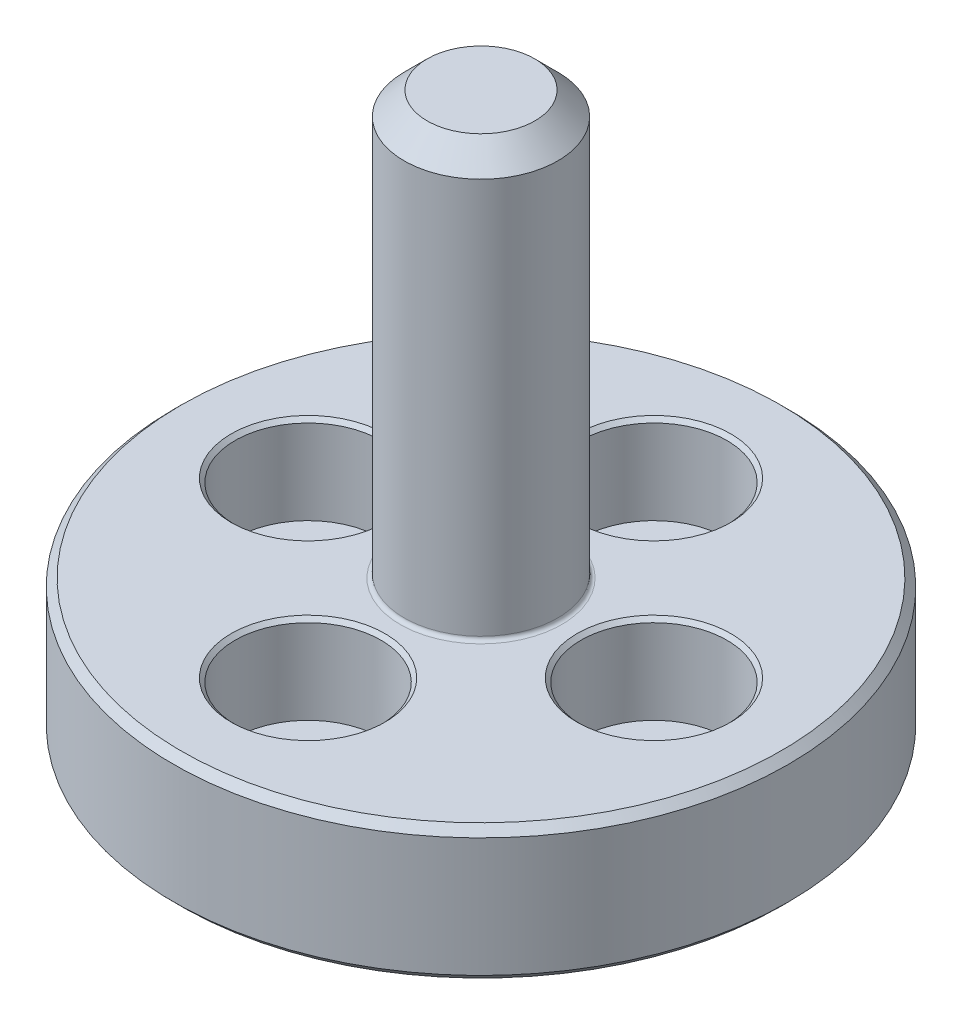
ISO-10303-21;
HEADER;
FILE_DESCRIPTION(('STEP AP214'),'2;1');
FILE_NAME('part.step','',(''),(''),'','','');
FILE_SCHEMA(('AUTOMOTIVE_DESIGN { 1 0 10303 214 1 1 1 1 }'));
ENDSEC;
DATA;
#1=APPLICATION_CONTEXT('core data for automotive mechanical design processes');
#2=APPLICATION_PROTOCOL_DEFINITION('international standard','automotive_design',2000,#1);
#3=PRODUCT_CONTEXT('',#1,'mechanical');
#4=PRODUCT('Part','Part','',(#3));
#5=PRODUCT_RELATED_PRODUCT_CATEGORY('part','',(#4));
#6=PRODUCT_DEFINITION_FORMATION('','',#4);
#7=PRODUCT_DEFINITION_CONTEXT('part definition',#1,'design');
#8=PRODUCT_DEFINITION('design','',#6,#7);
#9=PRODUCT_DEFINITION_SHAPE('','',#8);
#10=(LENGTH_UNIT() NAMED_UNIT(*) SI_UNIT(.MILLI.,.METRE.));
#11=(NAMED_UNIT(*) PLANE_ANGLE_UNIT() SI_UNIT($,.RADIAN.));
#12=(NAMED_UNIT(*) SI_UNIT($,.STERADIAN.) SOLID_ANGLE_UNIT());
#13=UNCERTAINTY_MEASURE_WITH_UNIT(LENGTH_MEASURE(1.E-05),#10,'distance_accuracy_value','');
#14=(GEOMETRIC_REPRESENTATION_CONTEXT(3) GLOBAL_UNCERTAINTY_ASSIGNED_CONTEXT((#13)) GLOBAL_UNIT_ASSIGNED_CONTEXT((#10,
#11,#12)) REPRESENTATION_CONTEXT('',''));
#15=CARTESIAN_POINT('',(0.,0.,0.));
#16=DIRECTION('',(0.,0.,1.));
#17=DIRECTION('',(1.,0.,0.));
#18=AXIS2_PLACEMENT_3D('',#15,#16,#17);
#19=CARTESIAN_POINT('',(-4.5,0.,0.));
#20=DIRECTION('',(0.,1.,0.));
#21=DIRECTION('',(-1.,0.,0.));
#22=AXIS2_PLACEMENT_3D('',#19,#20,#21);
#23=CYLINDRICAL_SURFACE('',#22,1.05);
#24=CARTESIAN_POINT('',(-4.5,0.099999999999995,0.));
#25=DIRECTION('',(0.,-1.,0.));
#26=DIRECTION('',(0.,0.,-1.));
#27=AXIS2_PLACEMENT_3D('',#24,#25,#26);
#28=CIRCLE('',#27,1.05);
#29=CARTESIAN_POINT('',(-4.5,0.099999999999995,-1.05000000000005));
#30=VERTEX_POINT('',#29);
#31=EDGE_CURVE('E92',#30,#30,#28,.T.);
#32=ORIENTED_EDGE('',*,*,#31,.T.);
#33=EDGE_LOOP('',(#32));
#34=FACE_BOUND('',#33,.T.);
#35=CARTESIAN_POINT('',(-4.5,1.2,0.));
#36=DIRECTION('',(0.,1.,0.));
#37=DIRECTION('',(-1.,0.,0.));
#38=AXIS2_PLACEMENT_3D('',#35,#36,#37);
#39=CIRCLE('',#38,1.05);
#40=CARTESIAN_POINT('',(-5.55,1.2,0.));
#41=VERTEX_POINT('',#40);
#42=EDGE_CURVE('E126',#41,#41,#39,.F.);
#43=ORIENTED_EDGE('',*,*,#42,.F.);
#44=EDGE_LOOP('',(#43));
#45=FACE_BOUND('',#44,.T.);
#46=ADVANCED_FACE('F36',(#34,#45),#23,.F.);
#47=CARTESIAN_POINT('',(0.,0.,4.5));
#48=DIRECTION('',(0.,1.,0.));
#49=DIRECTION('',(-1.,0.,0.));
#50=AXIS2_PLACEMENT_3D('',#47,#48,#49);
#51=CYLINDRICAL_SURFACE('',#50,1.05);
#52=CARTESIAN_POINT('',(0.,0.100000000000008,4.5));
#53=DIRECTION('',(0.,-1.,0.));
#54=DIRECTION('',(1.,0.,0.));
#55=AXIS2_PLACEMENT_3D('',#52,#53,#54);
#56=CIRCLE('',#55,1.05);
#57=CARTESIAN_POINT('',(1.05,0.100000000000008,4.5));
#58=VERTEX_POINT('',#57);
#59=EDGE_CURVE('E105',#58,#58,#56,.T.);
#60=ORIENTED_EDGE('',*,*,#59,.T.);
#61=EDGE_LOOP('',(#60));
#62=FACE_BOUND('',#61,.T.);
#63=CARTESIAN_POINT('',(0.,1.2,4.5));
#64=DIRECTION('',(0.,1.,0.));
#65=DIRECTION('',(-1.,0.,0.));
#66=AXIS2_PLACEMENT_3D('',#63,#64,#65);
#67=CIRCLE('',#66,1.05);
#68=CARTESIAN_POINT('',(-1.05,1.2,4.5));
#69=VERTEX_POINT('',#68);
#70=EDGE_CURVE('E132',#69,#69,#67,.F.);
#71=ORIENTED_EDGE('',*,*,#70,.F.);
#72=EDGE_LOOP('',(#71));
#73=FACE_BOUND('',#72,.T.);
#74=ADVANCED_FACE('F193',(#62,#73),#51,.F.);
#75=CARTESIAN_POINT('',(4.5,0.,0.));
#76=DIRECTION('',(0.,1.,0.));
#77=DIRECTION('',(-1.,0.,0.));
#78=AXIS2_PLACEMENT_3D('',#75,#76,#77);
#79=CYLINDRICAL_SURFACE('',#78,1.05);
#80=CARTESIAN_POINT('',(4.5,0.0999999999999953,0.));
#81=DIRECTION('',(0.,-1.,0.));
#82=DIRECTION('',(0.,0.,-1.));
#83=AXIS2_PLACEMENT_3D('',#80,#81,#82);
#84=CIRCLE('',#83,1.05);
#85=CARTESIAN_POINT('',(4.5,0.0999999999999953,-1.04999999999998));
#86=VERTEX_POINT('',#85);
#87=EDGE_CURVE('E119',#86,#86,#84,.T.);
#88=ORIENTED_EDGE('',*,*,#87,.T.);
#89=EDGE_LOOP('',(#88));
#90=FACE_BOUND('',#89,.T.);
#91=CARTESIAN_POINT('',(4.5,1.2,0.));
#92=DIRECTION('',(0.,1.,0.));
#93=DIRECTION('',(-1.,0.,0.));
#94=AXIS2_PLACEMENT_3D('',#91,#92,#93);
#95=CIRCLE('',#94,1.05);
#96=CARTESIAN_POINT('',(3.45,1.2,0.));
#97=VERTEX_POINT('',#96);
#98=EDGE_CURVE('E136',#97,#97,#95,.F.);
#99=ORIENTED_EDGE('',*,*,#98,.F.);
#100=EDGE_LOOP('',(#99));
#101=FACE_BOUND('',#100,.T.);
#102=ADVANCED_FACE('F199',(#90,#101),#79,.F.);
#103=CARTESIAN_POINT('',(0.,0.,-4.5));
#104=DIRECTION('',(0.,1.,0.));
#105=DIRECTION('',(-1.,0.,0.));
#106=AXIS2_PLACEMENT_3D('',#103,#104,#105);
#107=CYLINDRICAL_SURFACE('',#106,1.05);
#108=CARTESIAN_POINT('',(0.,0.100000000000001,-4.5));
#109=DIRECTION('',(0.,-1.,0.));
#110=DIRECTION('',(1.,0.,0.));
#111=AXIS2_PLACEMENT_3D('',#108,#109,#110);
#112=CIRCLE('',#111,1.05);
#113=CARTESIAN_POINT('',(1.05,0.1,-4.5));
#114=VERTEX_POINT('',#113);
#115=EDGE_CURVE('E147',#114,#114,#112,.T.);
#116=ORIENTED_EDGE('',*,*,#115,.T.);
#117=EDGE_LOOP('',(#116));
#118=FACE_BOUND('',#117,.T.);
#119=CARTESIAN_POINT('',(0.,1.2,-4.5));
#120=DIRECTION('',(0.,1.,0.));
#121=DIRECTION('',(-1.,0.,0.));
#122=AXIS2_PLACEMENT_3D('',#119,#120,#121);
#123=CIRCLE('',#122,1.05);
#124=CARTESIAN_POINT('',(-1.05,1.2,-4.5));
#125=VERTEX_POINT('',#124);
#126=EDGE_CURVE('E155',#125,#125,#123,.F.);
#127=ORIENTED_EDGE('',*,*,#126,.F.);
#128=EDGE_LOOP('',(#127));
#129=FACE_BOUND('',#128,.T.);
#130=ADVANCED_FACE('F209',(#118,#129),#107,.F.);
#131=CARTESIAN_POINT('',(0.,0.,0.));
#132=DIRECTION('',(0.,-1.,0.));
#133=DIRECTION('',(1.,0.,0.));
#134=AXIS2_PLACEMENT_3D('',#131,#132,#133);
#135=PLANE('',#134);
#136=CARTESIAN_POINT('',(0.,0.,0.));
#137=DIRECTION('',(0.,-1.,0.));
#138=DIRECTION('',(1.,0.,0.));
#139=AXIS2_PLACEMENT_3D('',#136,#137,#138);
#140=CIRCLE('',#139,1.2);
#141=CARTESIAN_POINT('',(1.2,0.,0.));
#142=VERTEX_POINT('',#141);
#143=EDGE_CURVE('E10',#142,#142,#140,.F.);
#144=ORIENTED_EDGE('',*,*,#143,.T.);
#145=EDGE_LOOP('',(#144));
#146=FACE_BOUND('',#145,.T.);
#147=CARTESIAN_POINT('',(0.,0.,0.));
#148=DIRECTION('',(0.,-1.,0.));
#149=DIRECTION('',(1.,0.,0.));
#150=AXIS2_PLACEMENT_3D('',#147,#148,#149);
#151=CIRCLE('',#150,7.8);
#152=CARTESIAN_POINT('',(7.8,0.,0.));
#153=VERTEX_POINT('',#152);
#154=EDGE_CURVE('E44',#153,#153,#151,.T.);
#155=ORIENTED_EDGE('',*,*,#154,.T.);
#156=EDGE_LOOP('',(#155));
#157=FACE_BOUND('',#156,.T.);
#158=CARTESIAN_POINT('',(-4.5,0.,0.));
#159=DIRECTION('',(0.,-1.,0.));
#160=DIRECTION('',(1.,0.,0.));
#161=AXIS2_PLACEMENT_3D('',#158,#159,#160);
#162=CIRCLE('',#161,1.14999999999999);
#163=CARTESIAN_POINT('',(-3.35000000000001,0.,0.));
#164=VERTEX_POINT('',#163);
#165=EDGE_CURVE('E96',#164,#164,#162,.F.);
#166=ORIENTED_EDGE('',*,*,#165,.T.);
#167=EDGE_LOOP('',(#166));
#168=FACE_BOUND('',#167,.T.);
#169=CARTESIAN_POINT('',(0.,0.,4.5));
#170=DIRECTION('',(0.,-1.,0.));
#171=DIRECTION('',(1.,0.,0.));
#172=AXIS2_PLACEMENT_3D('',#169,#170,#171);
#173=CIRCLE('',#172,1.15000000000001);
#174=CARTESIAN_POINT('',(1.15000000000001,0.,4.5));
#175=VERTEX_POINT('',#174);
#176=EDGE_CURVE('E108',#175,#175,#173,.F.);
#177=ORIENTED_EDGE('',*,*,#176,.T.);
#178=EDGE_LOOP('',(#177));
#179=FACE_BOUND('',#178,.T.);
#180=CARTESIAN_POINT('',(4.5,0.,0.));
#181=DIRECTION('',(0.,-1.,0.));
#182=DIRECTION('',(1.,0.,0.));
#183=AXIS2_PLACEMENT_3D('',#180,#181,#182);
#184=CIRCLE('',#183,1.14999999999999);
#185=CARTESIAN_POINT('',(5.64999999999999,0.,0.));
#186=VERTEX_POINT('',#185);
#187=EDGE_CURVE('E122',#186,#186,#184,.F.);
#188=ORIENTED_EDGE('',*,*,#187,.T.);
#189=EDGE_LOOP('',(#188));
#190=FACE_BOUND('',#189,.T.);
#191=CARTESIAN_POINT('',(0.,0.,-4.5));
#192=DIRECTION('',(0.,-1.,0.));
#193=DIRECTION('',(1.,0.,0.));
#194=AXIS2_PLACEMENT_3D('',#191,#192,#193);
#195=CIRCLE('',#194,1.15);
#196=CARTESIAN_POINT('',(1.15,0.,-4.5));
#197=VERTEX_POINT('',#196);
#198=EDGE_CURVE('E151',#197,#197,#195,.F.);
#199=ORIENTED_EDGE('',*,*,#198,.T.);
#200=EDGE_LOOP('',(#199));
#201=FACE_BOUND('',#200,.T.);
#202=ADVANCED_FACE('F223',(#146,#157,#168,#179,#190,#201),#135,.T.);
#203=CARTESIAN_POINT('',(0.,0.,0.));
#204=DIRECTION('',(0.,-1.,0.));
#205=DIRECTION('',(1.,0.,0.));
#206=AXIS2_PLACEMENT_3D('',#203,#204,#205);
#207=CYLINDRICAL_SURFACE('',#206,8.);
#208=CARTESIAN_POINT('',(0.,3.3,0.));
#209=DIRECTION('',(0.,1.,0.));
#210=DIRECTION('',(-1.,0.,0.));
#211=AXIS2_PLACEMENT_3D('',#208,#209,#210);
#212=CIRCLE('',#211,8.);
#213=CARTESIAN_POINT('',(-8.,3.3,0.));
#214=VERTEX_POINT('',#213);
#215=EDGE_CURVE('E62',#214,#214,#212,.F.);
#216=ORIENTED_EDGE('',*,*,#215,.T.);
#217=EDGE_LOOP('',(#216));
#218=FACE_BOUND('',#217,.T.);
#219=CARTESIAN_POINT('',(0.,0.199999999999997,0.));
#220=DIRECTION('',(0.,-1.,0.));
#221=DIRECTION('',(1.,0.,0.));
#222=AXIS2_PLACEMENT_3D('',#219,#220,#221);
#223=CIRCLE('',#222,8.);
#224=CARTESIAN_POINT('',(8.,0.199999999999994,0.));
#225=VERTEX_POINT('',#224);
#226=EDGE_CURVE('E66',#225,#225,#223,.F.);
#227=ORIENTED_EDGE('',*,*,#226,.T.);
#228=EDGE_LOOP('',(#227));
#229=FACE_BOUND('',#228,.T.);
#230=ADVANCED_FACE('F235',(#218,#229),#207,.T.);
#231=CARTESIAN_POINT('',(8.,3.5,0.));
#232=DIRECTION('',(0.,1.,0.));
#233=DIRECTION('',(-1.,0.,0.));
#234=AXIS2_PLACEMENT_3D('',#231,#232,#233);
#235=PLANE('',#234);
#236=CARTESIAN_POINT('',(0.,3.5,0.));
#237=DIRECTION('',(0.,1.,0.));
#238=DIRECTION('',(-1.,0.,0.));
#239=AXIS2_PLACEMENT_3D('',#236,#237,#238);
#240=CIRCLE('',#239,7.79999999999999);
#241=CARTESIAN_POINT('',(-7.79999999999999,3.5,0.));
#242=VERTEX_POINT('',#241);
#243=EDGE_CURVE('E57',#242,#242,#240,.T.);
#244=ORIENTED_EDGE('',*,*,#243,.T.);
#245=EDGE_LOOP('',(#244));
#246=FACE_BOUND('',#245,.T.);
#247=CARTESIAN_POINT('',(0.,3.5,0.));
#248=DIRECTION('',(0.,1.,0.));
#249=DIRECTION('',(-1.,0.,0.));
#250=AXIS2_PLACEMENT_3D('',#247,#248,#249);
#251=CIRCLE('',#250,2.1);
#252=CARTESIAN_POINT('',(-2.1,3.5,0.));
#253=VERTEX_POINT('',#252);
#254=EDGE_CURVE('E80',#253,#253,#251,.F.);
#255=ORIENTED_EDGE('',*,*,#254,.T.);
#256=EDGE_LOOP('',(#255));
#257=FACE_BOUND('',#256,.T.);
#258=CARTESIAN_POINT('',(-4.5,3.5,0.));
#259=DIRECTION('',(0.,1.,0.));
#260=DIRECTION('',(-1.,0.,0.));
#261=AXIS2_PLACEMENT_3D('',#258,#259,#260);
#262=CIRCLE('',#261,2.);
#263=CARTESIAN_POINT('',(-6.5,3.5,0.));
#264=VERTEX_POINT('',#263);
#265=EDGE_CURVE('E84',#264,#264,#262,.F.);
#266=ORIENTED_EDGE('',*,*,#265,.T.);
#267=EDGE_LOOP('',(#266));
#268=FACE_BOUND('',#267,.T.);
#269=CARTESIAN_POINT('',(0.,3.5,4.5));
#270=DIRECTION('',(0.,1.,0.));
#271=DIRECTION('',(-1.,0.,0.));
#272=AXIS2_PLACEMENT_3D('',#269,#270,#271);
#273=CIRCLE('',#272,2.);
#274=CARTESIAN_POINT('',(-2.,3.5,4.5));
#275=VERTEX_POINT('',#274);
#276=EDGE_CURVE('E99',#275,#275,#273,.F.);
#277=ORIENTED_EDGE('',*,*,#276,.T.);
#278=EDGE_LOOP('',(#277));
#279=FACE_BOUND('',#278,.T.);
#280=CARTESIAN_POINT('',(4.5,3.5,0.));
#281=DIRECTION('',(0.,1.,0.));
#282=DIRECTION('',(-1.,0.,0.));
#283=AXIS2_PLACEMENT_3D('',#280,#281,#282);
#284=CIRCLE('',#283,2.);
#285=CARTESIAN_POINT('',(2.5,3.5,0.));
#286=VERTEX_POINT('',#285);
#287=EDGE_CURVE('E111',#286,#286,#284,.F.);
#288=ORIENTED_EDGE('',*,*,#287,.T.);
#289=EDGE_LOOP('',(#288));
#290=FACE_BOUND('',#289,.T.);
#291=CARTESIAN_POINT('',(0.,3.5,-4.5));
#292=DIRECTION('',(0.,1.,0.));
#293=DIRECTION('',(-1.,0.,0.));
#294=AXIS2_PLACEMENT_3D('',#291,#292,#293);
#295=CIRCLE('',#294,2.);
#296=CARTESIAN_POINT('',(-2.,3.5,-4.5));
#297=VERTEX_POINT('',#296);
#298=EDGE_CURVE('E125',#297,#297,#295,.F.);
#299=ORIENTED_EDGE('',*,*,#298,.T.);
#300=EDGE_LOOP('',(#299));
#301=FACE_BOUND('',#300,.T.);
#302=ADVANCED_FACE('F231',(#246,#257,#268,#279,#290,#301),#235,.T.);
#303=CARTESIAN_POINT('',(0.,0.,0.));
#304=DIRECTION('',(0.,-1.,0.));
#305=DIRECTION('',(1.,0.,0.));
#306=AXIS2_PLACEMENT_3D('',#303,#304,#305);
#307=CYLINDRICAL_SURFACE('',#306,2.);
#308=CARTESIAN_POINT('',(0.,13.9,0.));
#309=DIRECTION('',(0.,1.,0.));
#310=DIRECTION('',(-1.,0.,0.));
#311=AXIS2_PLACEMENT_3D('',#308,#309,#310);
#312=CIRCLE('',#311,2.);
#313=CARTESIAN_POINT('',(-1.99999999999999,13.9,0.));
#314=VERTEX_POINT('',#313);
#315=EDGE_CURVE('E72',#314,#314,#312,.F.);
#316=ORIENTED_EDGE('',*,*,#315,.T.);
#317=EDGE_LOOP('',(#316));
#318=FACE_BOUND('',#317,.T.);
#319=CARTESIAN_POINT('',(0.,3.6,0.));
#320=DIRECTION('',(0.,1.,0.));
#321=DIRECTION('',(-1.,0.,0.));
#322=AXIS2_PLACEMENT_3D('',#319,#320,#321);
#323=CIRCLE('',#322,2.);
#324=CARTESIAN_POINT('',(-2.,3.6,0.));
#325=VERTEX_POINT('',#324);
#326=EDGE_CURVE('E76',#325,#325,#323,.T.);
#327=ORIENTED_EDGE('',*,*,#326,.T.);
#328=EDGE_LOOP('',(#327));
#329=FACE_BOUND('',#328,.T.);
#330=ADVANCED_FACE('F227',(#318,#329),#307,.T.);
#331=CARTESIAN_POINT('',(2.,14.5,0.));
#332=DIRECTION('',(0.,1.,0.));
#333=DIRECTION('',(-1.,0.,0.));
#334=AXIS2_PLACEMENT_3D('',#331,#332,#333);
#335=PLANE('',#334);
#336=CARTESIAN_POINT('',(0.,14.5,0.));
#337=DIRECTION('',(0.,1.,0.));
#338=DIRECTION('',(-1.,0.,0.));
#339=AXIS2_PLACEMENT_3D('',#336,#337,#338);
#340=CIRCLE('',#339,1.4);
#341=CARTESIAN_POINT('',(-1.4,14.5,0.));
#342=VERTEX_POINT('',#341);
#343=EDGE_CURVE('E69',#342,#342,#340,.T.);
#344=ORIENTED_EDGE('',*,*,#343,.T.);
#345=EDGE_LOOP('',(#344));
#346=FACE_BOUND('',#345,.T.);
#347=ADVANCED_FACE('F215',(#346),#335,.T.);
#348=CARTESIAN_POINT('',(0.,1.2,-4.5));
#349=DIRECTION('',(0.,1.,0.));
#350=DIRECTION('',(-1.,0.,0.));
#351=AXIS2_PLACEMENT_3D('',#348,#349,#350);
#352=PLANE('',#351);
#353=CARTESIAN_POINT('',(0.,1.2,-4.5));
#354=DIRECTION('',(0.,1.,0.));
#355=DIRECTION('',(-1.,0.,0.));
#356=AXIS2_PLACEMENT_3D('',#353,#354,#355);
#357=CIRCLE('',#356,1.9);
#358=CARTESIAN_POINT('',(-1.9,1.2,-4.5));
#359=VERTEX_POINT('',#358);
#360=EDGE_CURVE('E139',#359,#359,#357,.T.);
#361=ORIENTED_EDGE('',*,*,#360,.T.);
#362=EDGE_LOOP('',(#361));
#363=FACE_BOUND('',#362,.T.);
#364=ORIENTED_EDGE('',*,*,#126,.T.);
#365=EDGE_LOOP('',(#364));
#366=FACE_BOUND('',#365,.T.);
#367=ADVANCED_FACE('F211',(#363,#366),#352,.T.);
#368=CARTESIAN_POINT('',(0.,1.2,-4.5));
#369=DIRECTION('',(0.,1.,0.));
#370=DIRECTION('',(-1.,0.,0.));
#371=AXIS2_PLACEMENT_3D('',#368,#369,#370);
#372=CYLINDRICAL_SURFACE('',#371,1.9);
#373=CARTESIAN_POINT('',(0.,3.4,-4.5));
#374=DIRECTION('',(0.,1.,0.));
#375=DIRECTION('',(-1.,0.,0.));
#376=AXIS2_PLACEMENT_3D('',#373,#374,#375);
#377=CIRCLE('',#376,1.9);
#378=CARTESIAN_POINT('',(-1.9,3.4,-4.5));
#379=VERTEX_POINT('',#378);
#380=EDGE_CURVE('E143',#379,#379,#377,.T.);
#381=ORIENTED_EDGE('',*,*,#380,.T.);
#382=EDGE_LOOP('',(#381));
#383=FACE_BOUND('',#382,.T.);
#384=ORIENTED_EDGE('',*,*,#360,.F.);
#385=EDGE_LOOP('',(#384));
#386=FACE_BOUND('',#385,.T.);
#387=ADVANCED_FACE('F214',(#383,#386),#372,.F.);
#388=CARTESIAN_POINT('',(0.,0.,-4.5));
#389=DIRECTION('',(0.,-1.,0.));
#390=DIRECTION('',(1.,0.,0.));
#391=AXIS2_PLACEMENT_3D('',#388,#389,#390);
#392=CONICAL_SURFACE('',#391,1.15,0.785398163397459);
#393=CARTESIAN_POINT('',(1.05,0.1,-4.5));
#394=CARTESIAN_POINT('',(1.05104166666667,0.0989583333333337,-4.5));
#395=CARTESIAN_POINT('',(1.05208333333333,0.0979166666666671,-4.5));
#396=CARTESIAN_POINT('',(1.05416666666667,0.0958333333333338,-4.5));
#397=CARTESIAN_POINT('',(1.05520833333333,0.0947916666666671,-4.5));
#398=CARTESIAN_POINT('',(1.05729166666667,0.0927083333333338,-4.5));
#399=CARTESIAN_POINT('',(1.05833333333333,0.0916666666666671,-4.5));
#400=CARTESIAN_POINT('',(1.06041666666667,0.0895833333333338,-4.5));
#401=CARTESIAN_POINT('',(1.06145833333333,0.0885416666666671,-4.5));
#402=CARTESIAN_POINT('',(1.06354166666667,0.0864583333333338,-4.5));
#403=CARTESIAN_POINT('',(1.06458333333333,0.0854166666666671,-4.5));
#404=CARTESIAN_POINT('',(1.06666666666667,0.0833333333333338,-4.5));
#405=CARTESIAN_POINT('',(1.06770833333333,0.0822916666666672,-4.5));
#406=CARTESIAN_POINT('',(1.06979166666667,0.0802083333333338,-4.5));
#407=CARTESIAN_POINT('',(1.07083333333333,0.0791666666666672,-4.5));
#408=CARTESIAN_POINT('',(1.07291666666667,0.0770833333333339,-4.5));
#409=CARTESIAN_POINT('',(1.07395833333333,0.0760416666666672,-4.5));
#410=CARTESIAN_POINT('',(1.07604166666667,0.0739583333333338,-4.5));
#411=CARTESIAN_POINT('',(1.07708333333333,0.0729166666666672,-4.5));
#412=CARTESIAN_POINT('',(1.07916666666667,0.0708333333333339,-4.5));
#413=CARTESIAN_POINT('',(1.08020833333333,0.0697916666666672,-4.5));
#414=CARTESIAN_POINT('',(1.08229166666667,0.0677083333333339,-4.5));
#415=CARTESIAN_POINT('',(1.08333333333333,0.0666666666666672,-4.5));
#416=CARTESIAN_POINT('',(1.08541666666667,0.0645833333333339,-4.5));
#417=CARTESIAN_POINT('',(1.08645833333333,0.0635416666666673,-4.5));
#418=CARTESIAN_POINT('',(1.08854166666667,0.061458333333334,-4.5));
#419=CARTESIAN_POINT('',(1.08958333333333,0.0604166666666673,-4.5));
#420=CARTESIAN_POINT('',(1.09166666666667,0.058333333333334,-4.5));
#421=CARTESIAN_POINT('',(1.09270833333333,0.0572916666666673,-4.5));
#422=CARTESIAN_POINT('',(1.09479166666667,0.055208333333334,-4.5));
#423=CARTESIAN_POINT('',(1.09583333333333,0.0541666666666673,-4.5));
#424=CARTESIAN_POINT('',(1.09791666666667,0.052083333333334,-4.5));
#425=CARTESIAN_POINT('',(1.09895833333333,0.0510416666666674,-4.5));
#426=CARTESIAN_POINT('',(1.10104166666667,0.048958333333334,-4.5));
#427=CARTESIAN_POINT('',(1.10208333333333,0.0479166666666674,-4.5));
#428=CARTESIAN_POINT('',(1.10416666666667,0.0458333333333341,-4.5));
#429=CARTESIAN_POINT('',(1.10520833333333,0.0447916666666674,-4.5));
#430=CARTESIAN_POINT('',(1.10729166666667,0.0427083333333341,-4.5));
#431=CARTESIAN_POINT('',(1.10833333333333,0.0416666666666674,-4.5));
#432=CARTESIAN_POINT('',(1.11041666666667,0.0395833333333341,-4.5));
#433=CARTESIAN_POINT('',(1.11145833333333,0.0385416666666674,-4.5));
#434=CARTESIAN_POINT('',(1.11354166666667,0.0364583333333341,-4.5));
#435=CARTESIAN_POINT('',(1.11458333333333,0.0354166666666674,-4.5));
#436=CARTESIAN_POINT('',(1.11666666666667,0.0333333333333341,-4.5));
#437=CARTESIAN_POINT('',(1.11770833333333,0.0322916666666675,-4.5));
#438=CARTESIAN_POINT('',(1.11979166666667,0.0302083333333341,-4.5));
#439=CARTESIAN_POINT('',(1.12083333333333,0.0291666666666675,-4.5));
#440=CARTESIAN_POINT('',(1.12291666666667,0.0270833333333342,-4.5));
#441=CARTESIAN_POINT('',(1.12395833333334,0.0260416666666675,-4.5));
#442=CARTESIAN_POINT('',(1.12604166666667,0.0239583333333342,-4.5));
#443=CARTESIAN_POINT('',(1.12708333333333,0.0229166666666675,-4.5));
#444=CARTESIAN_POINT('',(1.12916666666667,0.0208333333333342,-4.5));
#445=CARTESIAN_POINT('',(1.13020833333334,0.0197916666666675,-4.5));
#446=CARTESIAN_POINT('',(1.13229166666667,0.0177083333333342,-4.5));
#447=CARTESIAN_POINT('',(1.13333333333334,0.0166666666666676,-4.5));
#448=CARTESIAN_POINT('',(1.13541666666667,0.0145833333333342,-4.5));
#449=CARTESIAN_POINT('',(1.13645833333334,0.0135416666666676,-4.5));
#450=CARTESIAN_POINT('',(1.13854166666667,0.0114583333333343,-4.5));
#451=CARTESIAN_POINT('',(1.13958333333334,0.0104166666666676,-4.5));
#452=CARTESIAN_POINT('',(1.14166666666667,0.00833333333333429,-4.5));
#453=CARTESIAN_POINT('',(1.14270833333334,0.00729166666666761,-4.5));
#454=CARTESIAN_POINT('',(1.14479166666667,0.00520833333333427,-4.5));
#455=CARTESIAN_POINT('',(1.14583333333334,0.00416666666666763,-4.5));
#456=CARTESIAN_POINT('',(1.14791666666667,0.00208333333333433,-4.5));
#457=CARTESIAN_POINT('',(1.14895833333334,0.00104166666666768,-4.5));
#458=CARTESIAN_POINT('',(1.15,0.,-4.5));
#459=B_SPLINE_CURVE_WITH_KNOTS('',3,(#393,#394,#395,#396,#397,#398,#399,#400,#401,#402,#403,
#404,#405,#406,#407,#408,#409,#410,#411,#412,#413,#414,#415,#416,#417,#418,#419,#420,#421,#422,
#423,#424,#425,#426,#427,#428,#429,#430,#431,#432,#433,#434,#435,#436,#437,#438,#439,#440,#441,
#442,#443,#444,#445,#446,#447,#448,#449,#450,#451,#452,#453,#454,#455,#456,#457,#458),
.UNSPECIFIED.,.F.,.F.,(4,2,2,2,2,2,2,2,2,2,2,2,2,2,2,2,2,2,2,2,2,2,2,2,2,2,2,2,2,2,2,2,4),(0.,
0.00441941738241597,0.00883883476483194,0.0132582521472478,0.0176776695296637,
0.0220970869120797,0.0265165042944957,0.0309359216769117,0.0353553390593275,0.0397747564417434,
0.0441941738241594,0.0486135912065754,0.0530330085889913,0.0574524259714072,0.0618718433538231,
0.0662912607362391,0.0707106781186551,0.0751300955010711,0.079549512883487,0.0839689302659028,
0.0883883476483188,0.0928077650307348,0.0972271824131507,0.101646599795567,0.106066017177983,
0.110485434560398,0.114904851942814,0.11932426932523,0.123743686707646,0.128163104090062,
0.132582521472478,0.137001938854894,0.14142135623731),.UNSPECIFIED.);
#460=EDGE_CURVE('BSEAM219',#114,#197,#459,.T.);
#461=ORIENTED_EDGE('',*,*,#115,.F.);
#462=ORIENTED_EDGE('',*,*,#198,.F.);
#463=ORIENTED_EDGE('',*,*,#460,.T.);
#464=ORIENTED_EDGE('',*,*,#460,.F.);
#465=EDGE_LOOP('',(#461,#463,#462,#464));
#466=FACE_BOUND('',#465,.T.);
#467=ADVANCED_FACE('F219',(#466),#392,.F.);
#468=CARTESIAN_POINT('',(0.,3.4,-4.5));
#469=DIRECTION('',(0.,1.,0.));
#470=DIRECTION('',(-1.,0.,0.));
#471=AXIS2_PLACEMENT_3D('',#468,#469,#470);
#472=CONICAL_SURFACE('',#471,1.9,0.785398163397449);
#473=ORIENTED_EDGE('',*,*,#298,.F.);
#474=EDGE_LOOP('',(#473));
#475=FACE_BOUND('',#474,.T.);
#476=ORIENTED_EDGE('',*,*,#380,.F.);
#477=EDGE_LOOP('',(#476));
#478=FACE_BOUND('',#477,.T.);
#479=ADVANCED_FACE('F244',(#475,#478),#472,.F.);
#480=CARTESIAN_POINT('',(4.5,1.2,0.));
#481=DIRECTION('',(0.,1.,0.));
#482=DIRECTION('',(0.,0.,-1.));
#483=AXIS2_PLACEMENT_3D('',#480,#481,#482);
#484=PLANE('',#483);
#485=CARTESIAN_POINT('',(4.5,1.2,0.));
#486=DIRECTION('',(0.,1.,0.));
#487=DIRECTION('',(0.,0.,-1.));
#488=AXIS2_PLACEMENT_3D('',#485,#486,#487);
#489=CIRCLE('',#488,1.9);
#490=CARTESIAN_POINT('',(4.50000000000001,1.2,-1.89999999999998));
#491=VERTEX_POINT('',#490);
#492=EDGE_CURVE('E135',#491,#491,#489,.T.);
#493=ORIENTED_EDGE('',*,*,#492,.T.);
#494=EDGE_LOOP('',(#493));
#495=FACE_BOUND('',#494,.T.);
#496=ORIENTED_EDGE('',*,*,#98,.T.);
#497=EDGE_LOOP('',(#496));
#498=FACE_BOUND('',#497,.T.);
#499=ADVANCED_FACE('F248',(#495,#498),#484,.T.);
#500=CARTESIAN_POINT('',(4.5,1.2,0.));
#501=DIRECTION('',(0.,1.,0.));
#502=DIRECTION('',(-1.,0.,0.));
#503=AXIS2_PLACEMENT_3D('',#500,#501,#502);
#504=CYLINDRICAL_SURFACE('',#503,1.9);
#505=CARTESIAN_POINT('',(4.5,3.4,0.));
#506=DIRECTION('',(0.,1.,0.));
#507=DIRECTION('',(0.,0.,1.));
#508=AXIS2_PLACEMENT_3D('',#505,#506,#507);
#509=CIRCLE('',#508,1.9);
#510=CARTESIAN_POINT('',(4.5,3.4,1.90000000000002));
#511=VERTEX_POINT('',#510);
#512=EDGE_CURVE('E115',#511,#511,#509,.T.);
#513=ORIENTED_EDGE('',*,*,#512,.T.);
#514=EDGE_LOOP('',(#513));
#515=FACE_BOUND('',#514,.T.);
#516=ORIENTED_EDGE('',*,*,#492,.F.);
#517=EDGE_LOOP('',(#516));
#518=FACE_BOUND('',#517,.T.);
#519=ADVANCED_FACE('F204',(#515,#518),#504,.F.);
#520=CARTESIAN_POINT('',(0.,1.2,4.5));
#521=DIRECTION('',(0.,1.,0.));
#522=DIRECTION('',(1.,0.,0.));
#523=AXIS2_PLACEMENT_3D('',#520,#521,#522);
#524=PLANE('',#523);
#525=CARTESIAN_POINT('',(0.,1.2,4.5));
#526=DIRECTION('',(0.,1.,0.));
#527=DIRECTION('',(1.,0.,0.));
#528=AXIS2_PLACEMENT_3D('',#525,#526,#527);
#529=CIRCLE('',#528,1.9);
#530=CARTESIAN_POINT('',(1.9,1.2,4.5));
#531=VERTEX_POINT('',#530);
#532=EDGE_CURVE('E130',#531,#531,#529,.T.);
#533=ORIENTED_EDGE('',*,*,#532,.T.);
#534=EDGE_LOOP('',(#533));
#535=FACE_BOUND('',#534,.T.);
#536=ORIENTED_EDGE('',*,*,#70,.T.);
#537=EDGE_LOOP('',(#536));
#538=FACE_BOUND('',#537,.T.);
#539=ADVANCED_FACE('F422',(#535,#538),#524,.T.);
#540=CARTESIAN_POINT('',(0.,1.2,4.5));
#541=DIRECTION('',(0.,1.,0.));
#542=DIRECTION('',(-1.,0.,0.));
#543=AXIS2_PLACEMENT_3D('',#540,#541,#542);
#544=CYLINDRICAL_SURFACE('',#543,1.9);
#545=CARTESIAN_POINT('',(0.,3.4,4.5));
#546=DIRECTION('',(0.,1.,0.));
#547=DIRECTION('',(-1.,0.,0.));
#548=AXIS2_PLACEMENT_3D('',#545,#546,#547);
#549=CIRCLE('',#548,1.9);
#550=CARTESIAN_POINT('',(-1.9,3.4,4.5));
#551=VERTEX_POINT('',#550);
#552=EDGE_CURVE('E102',#551,#551,#549,.T.);
#553=ORIENTED_EDGE('',*,*,#552,.T.);
#554=EDGE_LOOP('',(#553));
#555=FACE_BOUND('',#554,.T.);
#556=ORIENTED_EDGE('',*,*,#532,.F.);
#557=EDGE_LOOP('',(#556));
#558=FACE_BOUND('',#557,.T.);
#559=ADVANCED_FACE('F414',(#555,#558),#544,.F.);
#560=CARTESIAN_POINT('',(-4.5,1.2,0.));
#561=DIRECTION('',(0.,1.,0.));
#562=DIRECTION('',(0.,0.,1.));
#563=AXIS2_PLACEMENT_3D('',#560,#561,#562);
#564=PLANE('',#563);
#565=CARTESIAN_POINT('',(-4.5,1.2,0.));
#566=DIRECTION('',(0.,1.,0.));
#567=DIRECTION('',(0.,0.,1.));
#568=AXIS2_PLACEMENT_3D('',#565,#566,#567);
#569=CIRCLE('',#568,1.9);
#570=CARTESIAN_POINT('',(-4.50000000000002,1.2,1.89999999999995));
#571=VERTEX_POINT('',#570);
#572=EDGE_CURVE('E131',#571,#571,#569,.T.);
#573=ORIENTED_EDGE('',*,*,#572,.T.);
#574=EDGE_LOOP('',(#573));
#575=FACE_BOUND('',#574,.T.);
#576=ORIENTED_EDGE('',*,*,#42,.T.);
#577=EDGE_LOOP('',(#576));
#578=FACE_BOUND('',#577,.T.);
#579=ADVANCED_FACE('F405',(#575,#578),#564,.T.);
#580=CARTESIAN_POINT('',(-4.5,1.2,0.));
#581=DIRECTION('',(0.,1.,0.));
#582=DIRECTION('',(-1.,0.,0.));
#583=AXIS2_PLACEMENT_3D('',#580,#581,#582);
#584=CYLINDRICAL_SURFACE('',#583,1.9);
#585=CARTESIAN_POINT('',(-4.5,3.4,0.));
#586=DIRECTION('',(0.,1.,0.));
#587=DIRECTION('',(0.,0.,1.));
#588=AXIS2_PLACEMENT_3D('',#585,#586,#587);
#589=CIRCLE('',#588,1.9);
#590=CARTESIAN_POINT('',(-4.5,3.4,1.89999999999995));
#591=VERTEX_POINT('',#590);
#592=EDGE_CURVE('E88',#591,#591,#589,.T.);
#593=ORIENTED_EDGE('',*,*,#592,.T.);
#594=EDGE_LOOP('',(#593));
#595=FACE_BOUND('',#594,.T.);
#596=ORIENTED_EDGE('',*,*,#572,.F.);
#597=EDGE_LOOP('',(#596));
#598=FACE_BOUND('',#597,.T.);
#599=ADVANCED_FACE('F254',(#595,#598),#584,.F.);
#600=CARTESIAN_POINT('',(4.5,0.,0.));
#601=DIRECTION('',(0.,-1.,0.));
#602=DIRECTION('',(0.,0.,-1.));
#603=AXIS2_PLACEMENT_3D('',#600,#601,#602);
#604=CONICAL_SURFACE('',#603,1.14999999999999,0.785398163397442);
#605=ORIENTED_EDGE('',*,*,#87,.F.);
#606=EDGE_LOOP('',(#605));
#607=FACE_BOUND('',#606,.T.);
#608=ORIENTED_EDGE('',*,*,#187,.F.);
#609=EDGE_LOOP('',(#608));
#610=FACE_BOUND('',#609,.T.);
#611=ADVANCED_FACE('F250',(#607,#610),#604,.F.);
#612=CARTESIAN_POINT('',(4.5,3.4,0.));
#613=DIRECTION('',(0.,1.,0.));
#614=DIRECTION('',(0.,0.,1.));
#615=AXIS2_PLACEMENT_3D('',#612,#613,#614);
#616=CONICAL_SURFACE('',#615,1.9,0.785398163397447);
#617=ORIENTED_EDGE('',*,*,#287,.F.);
#618=EDGE_LOOP('',(#617));
#619=FACE_BOUND('',#618,.T.);
#620=ORIENTED_EDGE('',*,*,#512,.F.);
#621=EDGE_LOOP('',(#620));
#622=FACE_BOUND('',#621,.T.);
#623=ADVANCED_FACE('F253',(#619,#622),#616,.F.);
#624=CARTESIAN_POINT('',(0.,0.,4.5));
#625=DIRECTION('',(0.,-1.,0.));
#626=DIRECTION('',(1.,0.,0.));
#627=AXIS2_PLACEMENT_3D('',#624,#625,#626);
#628=CONICAL_SURFACE('',#627,1.15000000000001,0.785398163397436);
#629=ORIENTED_EDGE('',*,*,#59,.F.);
#630=EDGE_LOOP('',(#629));
#631=FACE_BOUND('',#630,.T.);
#632=ORIENTED_EDGE('',*,*,#176,.F.);
#633=EDGE_LOOP('',(#632));
#634=FACE_BOUND('',#633,.T.);
#635=ADVANCED_FACE('F258',(#631,#634),#628,.F.);
#636=CARTESIAN_POINT('',(0.,3.4,4.5));
#637=DIRECTION('',(0.,1.,0.));
#638=DIRECTION('',(-1.,0.,0.));
#639=AXIS2_PLACEMENT_3D('',#636,#637,#638);
#640=CONICAL_SURFACE('',#639,1.9,0.785398163397449);
#641=ORIENTED_EDGE('',*,*,#276,.F.);
#642=EDGE_LOOP('',(#641));
#643=FACE_BOUND('',#642,.T.);
#644=ORIENTED_EDGE('',*,*,#552,.F.);
#645=EDGE_LOOP('',(#644));
#646=FACE_BOUND('',#645,.T.);
#647=ADVANCED_FACE('F262',(#643,#646),#640,.F.);
#648=CARTESIAN_POINT('',(-4.5,0.,0.));
#649=DIRECTION('',(0.,-1.,0.));
#650=DIRECTION('',(0.,0.,-1.));
#651=AXIS2_PLACEMENT_3D('',#648,#649,#650);
#652=CONICAL_SURFACE('',#651,1.14999999999999,0.785398163397442);
#653=ORIENTED_EDGE('',*,*,#31,.F.);
#654=EDGE_LOOP('',(#653));
#655=FACE_BOUND('',#654,.T.);
#656=ORIENTED_EDGE('',*,*,#165,.F.);
#657=EDGE_LOOP('',(#656));
#658=FACE_BOUND('',#657,.T.);
#659=ADVANCED_FACE('F266',(#655,#658),#652,.F.);
#660=CARTESIAN_POINT('',(-4.5,3.4,0.));
#661=DIRECTION('',(0.,1.,0.));
#662=DIRECTION('',(0.,0.,1.));
#663=AXIS2_PLACEMENT_3D('',#660,#661,#662);
#664=CONICAL_SURFACE('',#663,1.9,0.785398163397447);
#665=ORIENTED_EDGE('',*,*,#265,.F.);
#666=EDGE_LOOP('',(#665));
#667=FACE_BOUND('',#666,.T.);
#668=ORIENTED_EDGE('',*,*,#592,.F.);
#669=EDGE_LOOP('',(#668));
#670=FACE_BOUND('',#669,.T.);
#671=ADVANCED_FACE('F270',(#667,#670),#664,.F.);
#672=CARTESIAN_POINT('',(0.,3.6,0.));
#673=DIRECTION('',(0.,1.,0.));
#674=DIRECTION('',(-1.,0.,0.));
#675=AXIS2_PLACEMENT_3D('',#672,#673,#674);
#676=TOROIDAL_SURFACE('',#675,2.1,0.1);
#677=ORIENTED_EDGE('',*,*,#326,.F.);
#678=EDGE_LOOP('',(#677));
#679=FACE_BOUND('',#678,.T.);
#680=ORIENTED_EDGE('',*,*,#254,.F.);
#681=EDGE_LOOP('',(#680));
#682=FACE_BOUND('',#681,.T.);
#683=ADVANCED_FACE('F188',(#679,#682),#676,.F.);
#684=CARTESIAN_POINT('',(0.,13.9,0.));
#685=DIRECTION('',(0.,-1.,0.));
#686=DIRECTION('',(1.,0.,0.));
#687=AXIS2_PLACEMENT_3D('',#684,#685,#686);
#688=CONICAL_SURFACE('',#687,2.,0.785398163397449);
#689=ORIENTED_EDGE('',*,*,#343,.F.);
#690=EDGE_LOOP('',(#689));
#691=FACE_BOUND('',#690,.T.);
#692=ORIENTED_EDGE('',*,*,#315,.F.);
#693=EDGE_LOOP('',(#692));
#694=FACE_BOUND('',#693,.T.);
#695=ADVANCED_FACE('F179',(#691,#694),#688,.T.);
#696=CARTESIAN_POINT('',(0.,4.5,0.));
#697=DIRECTION('',(0.,-1.,0.));
#698=DIRECTION('',(1.,0.,0.));
#699=AXIS2_PLACEMENT_3D('',#696,#697,#698);
#700=CYLINDRICAL_SURFACE('',#699,1.);
#701=CARTESIAN_POINT('',(0.,0.200000000000005,0.));
#702=DIRECTION('',(0.,-1.,0.));
#703=DIRECTION('',(1.,0.,0.));
#704=AXIS2_PLACEMENT_3D('',#701,#702,#703);
#705=CIRCLE('',#704,1.);
#706=CARTESIAN_POINT('',(1.,0.200000000000005,0.));
#707=VERTEX_POINT('',#706);
#708=EDGE_CURVE('E51',#707,#707,#705,.T.);
#709=ORIENTED_EDGE('',*,*,#708,.T.);
#710=EDGE_LOOP('',(#709));
#711=FACE_BOUND('',#710,.T.);
#712=CARTESIAN_POINT('',(0.,4.5,0.));
#713=DIRECTION('',(0.,-1.,0.));
#714=DIRECTION('',(1.,0.,0.));
#715=AXIS2_PLACEMENT_3D('',#712,#713,#714);
#716=CIRCLE('',#715,1.);
#717=CARTESIAN_POINT('',(1.,4.5,0.));
#718=VERTEX_POINT('',#717);
#719=EDGE_CURVE('E170',#718,#718,#716,.T.);
#720=ORIENTED_EDGE('',*,*,#719,.F.);
#721=EDGE_LOOP('',(#720));
#722=FACE_BOUND('',#721,.T.);
#723=ADVANCED_FACE('F177',(#711,#722),#700,.F.);
#724=CARTESIAN_POINT('',(0.,4.5,0.));
#725=DIRECTION('',(0.,-1.,0.));
#726=DIRECTION('',(1.,0.,0.));
#727=AXIS2_PLACEMENT_3D('',#724,#725,#726);
#728=PLANE('',#727);
#729=ORIENTED_EDGE('',*,*,#719,.T.);
#730=EDGE_LOOP('',(#729));
#731=FACE_BOUND('',#730,.T.);
#732=ADVANCED_FACE('F175',(#731),#728,.T.);
#733=CARTESIAN_POINT('',(0.,3.3,0.));
#734=DIRECTION('',(0.,-1.,0.));
#735=DIRECTION('',(1.,0.,0.));
#736=AXIS2_PLACEMENT_3D('',#733,#734,#735);
#737=CONICAL_SURFACE('',#736,8.,0.785398163397448);
#738=ORIENTED_EDGE('',*,*,#243,.F.);
#739=EDGE_LOOP('',(#738));
#740=FACE_BOUND('',#739,.T.);
#741=ORIENTED_EDGE('',*,*,#215,.F.);
#742=EDGE_LOOP('',(#741));
#743=FACE_BOUND('',#742,.T.);
#744=ADVANCED_FACE('F186',(#740,#743),#737,.T.);
#745=CARTESIAN_POINT('',(0.,0.200000000000005,0.));
#746=DIRECTION('',(0.,-1.,0.));
#747=DIRECTION('',(1.,0.,0.));
#748=AXIS2_PLACEMENT_3D('',#745,#746,#747);
#749=CONICAL_SURFACE('',#748,1.,0.785398163397447);
#750=ORIENTED_EDGE('',*,*,#143,.F.);
#751=EDGE_LOOP('',(#750));
#752=FACE_BOUND('',#751,.T.);
#753=ORIENTED_EDGE('',*,*,#708,.F.);
#754=EDGE_LOOP('',(#753));
#755=FACE_BOUND('',#754,.T.);
#756=ADVANCED_FACE('F279',(#752,#755),#749,.F.);
#757=CARTESIAN_POINT('',(0.,0.,0.));
#758=DIRECTION('',(0.,1.,0.));
#759=DIRECTION('',(-1.,0.,0.));
#760=AXIS2_PLACEMENT_3D('',#757,#758,#759);
#761=CONICAL_SURFACE('',#760,7.8,0.785398163397466);
#762=ORIENTED_EDGE('',*,*,#226,.F.);
#763=EDGE_LOOP('',(#762));
#764=FACE_BOUND('',#763,.T.);
#765=ORIENTED_EDGE('',*,*,#154,.F.);
#766=EDGE_LOOP('',(#765));
#767=FACE_BOUND('',#766,.T.);
#768=ADVANCED_FACE('F38',(#764,#767),#761,.T.);
#769=CLOSED_SHELL('',(#46,#74,#102,#130,#202,#230,#302,#330,#347,#367,#387,#467,#479,#499,#519,
#539,#559,#579,#599,#611,#623,#635,#647,#659,#671,#683,#695,#723,#732,#744,#756,#768));
#770=MANIFOLD_SOLID_BREP('B2',#769);
#771=ADVANCED_BREP_SHAPE_REPRESENTATION('',(#18,#770),#14);
#772=SHAPE_DEFINITION_REPRESENTATION(#9,#771);
ENDSEC;
END-ISO-10303-21;
